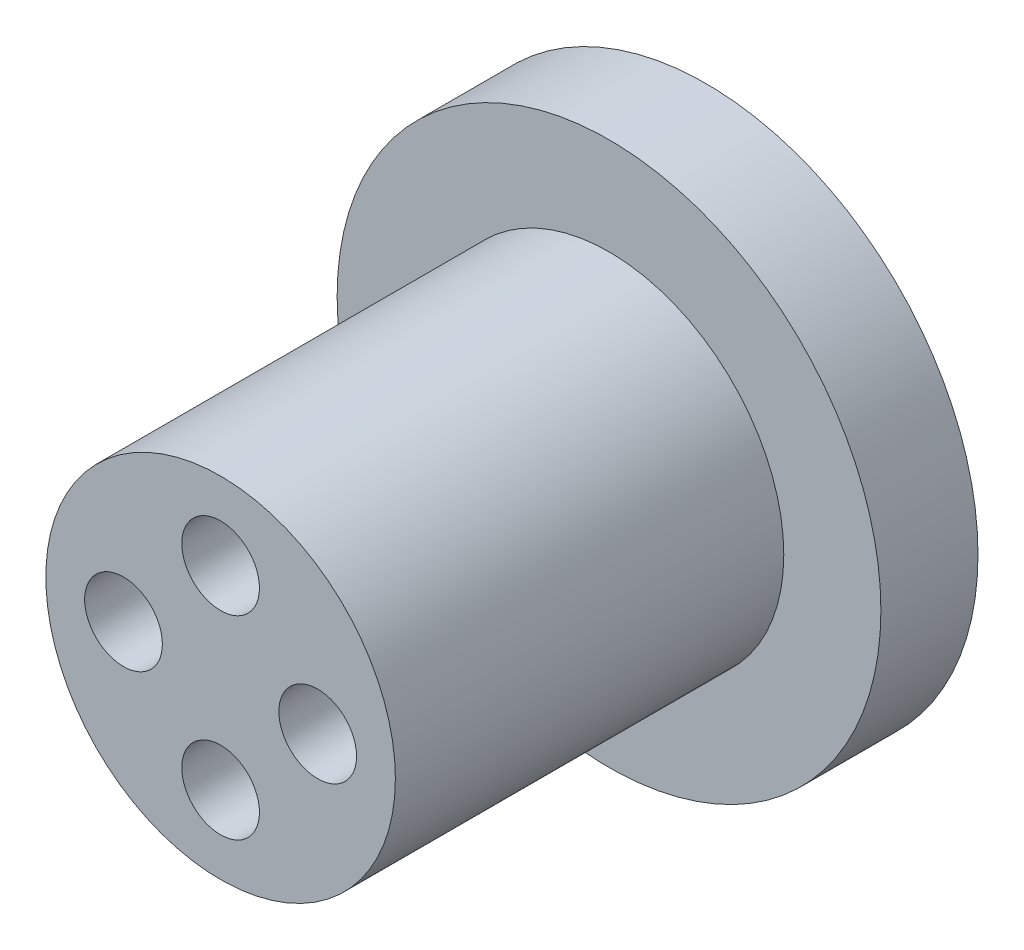
ISO-10303-21;
HEADER;
FILE_DESCRIPTION(('STEP AP214'),'2;1');
FILE_NAME('part.step','',(''),(''),'','','');
FILE_SCHEMA(('AUTOMOTIVE_DESIGN { 1 0 10303 214 1 1 1 1 }'));
ENDSEC;
DATA;
#1=APPLICATION_CONTEXT('core data for automotive mechanical design processes');
#2=APPLICATION_PROTOCOL_DEFINITION('international standard','automotive_design',2000,#1);
#3=PRODUCT_CONTEXT('',#1,'mechanical');
#4=PRODUCT('Part','Part','',(#3));
#5=PRODUCT_RELATED_PRODUCT_CATEGORY('part','',(#4));
#6=PRODUCT_DEFINITION_FORMATION('','',#4);
#7=PRODUCT_DEFINITION_CONTEXT('part definition',#1,'design');
#8=PRODUCT_DEFINITION('design','',#6,#7);
#9=PRODUCT_DEFINITION_SHAPE('','',#8);
#10=(LENGTH_UNIT() NAMED_UNIT(*) SI_UNIT(.MILLI.,.METRE.));
#11=(NAMED_UNIT(*) PLANE_ANGLE_UNIT() SI_UNIT($,.RADIAN.));
#12=(NAMED_UNIT(*) SI_UNIT($,.STERADIAN.) SOLID_ANGLE_UNIT());
#13=UNCERTAINTY_MEASURE_WITH_UNIT(LENGTH_MEASURE(1.E-05),#10,'distance_accuracy_value','');
#14=(GEOMETRIC_REPRESENTATION_CONTEXT(3) GLOBAL_UNCERTAINTY_ASSIGNED_CONTEXT((#13)) GLOBAL_UNIT_ASSIGNED_CONTEXT((#10,
#11,#12)) REPRESENTATION_CONTEXT('',''));
#15=CARTESIAN_POINT('',(0.,0.,0.));
#16=DIRECTION('',(0.,0.,1.));
#17=DIRECTION('',(1.,0.,0.));
#18=AXIS2_PLACEMENT_3D('',#15,#16,#17);
#19=CARTESIAN_POINT('',(0.,0.,2.5));
#20=DIRECTION('',(0.,0.,-1.));
#21=DIRECTION('',(-1.,0.,0.));
#22=AXIS2_PLACEMENT_3D('',#19,#20,#21);
#23=CYLINDRICAL_SURFACE('',#22,7.);
#24=CARTESIAN_POINT('',(0.,0.,2.5));
#25=DIRECTION('',(0.,0.,1.));
#26=DIRECTION('',(1.,0.,0.));
#27=AXIS2_PLACEMENT_3D('',#24,#25,#26);
#28=CIRCLE('',#27,7.);
#29=CARTESIAN_POINT('',(7.,0.,2.5));
#30=VERTEX_POINT('',#29);
#31=EDGE_CURVE('E45',#30,#30,#28,.T.);
#32=ORIENTED_EDGE('',*,*,#31,.F.);
#33=EDGE_LOOP('',(#32));
#34=FACE_BOUND('',#33,.T.);
#35=CARTESIAN_POINT('',(0.,0.,0.));
#36=DIRECTION('',(0.,0.,1.));
#37=DIRECTION('',(1.,0.,0.));
#38=AXIS2_PLACEMENT_3D('',#35,#36,#37);
#39=CIRCLE('',#38,7.);
#40=CARTESIAN_POINT('',(7.,0.,0.));
#41=VERTEX_POINT('',#40);
#42=EDGE_CURVE('E40',#41,#41,#39,.T.);
#43=ORIENTED_EDGE('',*,*,#42,.T.);
#44=EDGE_LOOP('',(#43));
#45=FACE_BOUND('',#44,.T.);
#46=ADVANCED_FACE('F37',(#34,#45),#23,.T.);
#47=CARTESIAN_POINT('',(0.,0.,2.5));
#48=DIRECTION('',(0.,0.,1.));
#49=DIRECTION('',(1.,0.,0.));
#50=AXIS2_PLACEMENT_3D('',#47,#48,#49);
#51=PLANE('',#50);
#52=CARTESIAN_POINT('',(0.,0.,2.5));
#53=DIRECTION('',(0.,0.,1.));
#54=DIRECTION('',(1.,0.,0.));
#55=AXIS2_PLACEMENT_3D('',#52,#53,#54);
#56=CIRCLE('',#55,4.5);
#57=CARTESIAN_POINT('',(4.5,0.,2.5));
#58=VERTEX_POINT('',#57);
#59=EDGE_CURVE('E10',#58,#58,#56,.T.);
#60=ORIENTED_EDGE('',*,*,#59,.F.);
#61=EDGE_LOOP('',(#60));
#62=FACE_BOUND('',#61,.T.);
#63=ORIENTED_EDGE('',*,*,#31,.T.);
#64=EDGE_LOOP('',(#63));
#65=FACE_BOUND('',#64,.T.);
#66=ADVANCED_FACE('F118',(#62,#65),#51,.T.);
#67=CARTESIAN_POINT('',(0.,0.,0.));
#68=DIRECTION('',(0.,0.,1.));
#69=DIRECTION('',(1.,0.,0.));
#70=AXIS2_PLACEMENT_3D('',#67,#68,#69);
#71=PLANE('',#70);
#72=ORIENTED_EDGE('',*,*,#42,.F.);
#73=EDGE_LOOP('',(#72));
#74=FACE_BOUND('',#73,.T.);
#75=ADVANCED_FACE('F113',(#74),#71,.F.);
#76=CARTESIAN_POINT('',(0.,0.,12.5));
#77=DIRECTION('',(0.,0.,-1.));
#78=DIRECTION('',(-1.,0.,0.));
#79=AXIS2_PLACEMENT_3D('',#76,#77,#78);
#80=CYLINDRICAL_SURFACE('',#79,4.5);
#81=CARTESIAN_POINT('',(0.,0.,12.5));
#82=DIRECTION('',(0.,0.,1.));
#83=DIRECTION('',(1.,0.,0.));
#84=AXIS2_PLACEMENT_3D('',#81,#82,#83);
#85=CIRCLE('',#84,4.5);
#86=CARTESIAN_POINT('',(4.5,0.,12.5));
#87=VERTEX_POINT('',#86);
#88=EDGE_CURVE('E52',#87,#87,#85,.T.);
#89=ORIENTED_EDGE('',*,*,#88,.F.);
#90=EDGE_LOOP('',(#89));
#91=FACE_BOUND('',#90,.T.);
#92=ORIENTED_EDGE('',*,*,#59,.T.);
#93=EDGE_LOOP('',(#92));
#94=FACE_BOUND('',#93,.T.);
#95=ADVANCED_FACE('F102',(#91,#94),#80,.T.);
#96=CARTESIAN_POINT('',(0.,0.,12.5));
#97=DIRECTION('',(0.,0.,1.));
#98=DIRECTION('',(1.,0.,0.));
#99=AXIS2_PLACEMENT_3D('',#96,#97,#98);
#100=PLANE('',#99);
#101=CARTESIAN_POINT('',(0.,2.5,12.5));
#102=DIRECTION('',(0.,0.,1.));
#103=DIRECTION('',(1.,0.,0.));
#104=AXIS2_PLACEMENT_3D('',#101,#102,#103);
#105=CIRCLE('',#104,1.);
#106=CARTESIAN_POINT('',(1.,2.5,12.5));
#107=VERTEX_POINT('',#106);
#108=EDGE_CURVE('E81',#107,#107,#105,.T.);
#109=ORIENTED_EDGE('',*,*,#108,.F.);
#110=EDGE_LOOP('',(#109));
#111=FACE_BOUND('',#110,.T.);
#112=CARTESIAN_POINT('',(2.50000000000007,0.,12.5));
#113=DIRECTION('',(0.,0.,1.));
#114=DIRECTION('',(1.,0.,0.));
#115=AXIS2_PLACEMENT_3D('',#112,#113,#114);
#116=CIRCLE('',#115,1.);
#117=CARTESIAN_POINT('',(3.50000000000007,0.,12.5));
#118=VERTEX_POINT('',#117);
#119=EDGE_CURVE('E73',#118,#118,#116,.T.);
#120=ORIENTED_EDGE('',*,*,#119,.F.);
#121=EDGE_LOOP('',(#120));
#122=FACE_BOUND('',#121,.T.);
#123=CARTESIAN_POINT('',(1.4119006205266E-13,-2.5,12.5));
#124=DIRECTION('',(0.,0.,1.));
#125=DIRECTION('',(1.,0.,0.));
#126=AXIS2_PLACEMENT_3D('',#123,#124,#125);
#127=CIRCLE('',#126,1.);
#128=CARTESIAN_POINT('',(1.00000000000014,-2.5,12.5));
#129=VERTEX_POINT('',#128);
#130=EDGE_CURVE('E65',#129,#129,#127,.T.);
#131=ORIENTED_EDGE('',*,*,#130,.F.);
#132=EDGE_LOOP('',(#131));
#133=FACE_BOUND('',#132,.T.);
#134=CARTESIAN_POINT('',(-2.49999999999993,0.,12.5));
#135=DIRECTION('',(0.,0.,1.));
#136=DIRECTION('',(1.,0.,0.));
#137=AXIS2_PLACEMENT_3D('',#134,#135,#136);
#138=CIRCLE('',#137,1.);
#139=CARTESIAN_POINT('',(-1.49999999999993,0.,12.5));
#140=VERTEX_POINT('',#139);
#141=EDGE_CURVE('E57',#140,#140,#138,.T.);
#142=ORIENTED_EDGE('',*,*,#141,.F.);
#143=EDGE_LOOP('',(#142));
#144=FACE_BOUND('',#143,.T.);
#145=ORIENTED_EDGE('',*,*,#88,.T.);
#146=EDGE_LOOP('',(#145));
#147=FACE_BOUND('',#146,.T.);
#148=ADVANCED_FACE('F98',(#111,#122,#133,#144,#147),#100,.T.);
#149=CARTESIAN_POINT('',(-2.49999999999993,0.,7.5));
#150=DIRECTION('',(0.,0.,1.));
#151=DIRECTION('',(1.,0.,0.));
#152=AXIS2_PLACEMENT_3D('',#149,#150,#151);
#153=CYLINDRICAL_SURFACE('',#152,1.);
#154=CARTESIAN_POINT('',(-2.49999999999993,0.,7.5));
#155=DIRECTION('',(0.,0.,1.));
#156=DIRECTION('',(1.,0.,0.));
#157=AXIS2_PLACEMENT_3D('',#154,#155,#156);
#158=CIRCLE('',#157,1.);
#159=CARTESIAN_POINT('',(-1.49999999999993,0.,7.5));
#160=VERTEX_POINT('',#159);
#161=EDGE_CURVE('E61',#160,#160,#158,.T.);
#162=ORIENTED_EDGE('',*,*,#161,.F.);
#163=EDGE_LOOP('',(#162));
#164=FACE_BOUND('',#163,.T.);
#165=ORIENTED_EDGE('',*,*,#141,.T.);
#166=EDGE_LOOP('',(#165));
#167=FACE_BOUND('',#166,.T.);
#168=ADVANCED_FACE('F101',(#164,#167),#153,.F.);
#169=CARTESIAN_POINT('',(-2.49999999999993,0.,7.5));
#170=DIRECTION('',(0.,0.,1.));
#171=DIRECTION('',(1.,0.,0.));
#172=AXIS2_PLACEMENT_3D('',#169,#170,#171);
#173=PLANE('',#172);
#174=ORIENTED_EDGE('',*,*,#161,.T.);
#175=EDGE_LOOP('',(#174));
#176=FACE_BOUND('',#175,.T.);
#177=ADVANCED_FACE('F164',(#176),#173,.T.);
#178=CARTESIAN_POINT('',(1.4119006205266E-13,-2.5,7.5));
#179=DIRECTION('',(0.,0.,1.));
#180=DIRECTION('',(1.,0.,0.));
#181=AXIS2_PLACEMENT_3D('',#178,#179,#180);
#182=CYLINDRICAL_SURFACE('',#181,1.);
#183=CARTESIAN_POINT('',(1.4119006205266E-13,-2.5,7.5));
#184=DIRECTION('',(0.,0.,1.));
#185=DIRECTION('',(1.,0.,0.));
#186=AXIS2_PLACEMENT_3D('',#183,#184,#185);
#187=CIRCLE('',#186,1.);
#188=CARTESIAN_POINT('',(1.00000000000014,-2.5,7.5));
#189=VERTEX_POINT('',#188);
#190=EDGE_CURVE('E69',#189,#189,#187,.T.);
#191=ORIENTED_EDGE('',*,*,#190,.F.);
#192=EDGE_LOOP('',(#191));
#193=FACE_BOUND('',#192,.T.);
#194=ORIENTED_EDGE('',*,*,#130,.T.);
#195=EDGE_LOOP('',(#194));
#196=FACE_BOUND('',#195,.T.);
#197=ADVANCED_FACE('F173',(#193,#196),#182,.F.);
#198=CARTESIAN_POINT('',(1.4119006205266E-13,-2.5,7.5));
#199=DIRECTION('',(0.,0.,1.));
#200=DIRECTION('',(1.,0.,0.));
#201=AXIS2_PLACEMENT_3D('',#198,#199,#200);
#202=PLANE('',#201);
#203=ORIENTED_EDGE('',*,*,#190,.T.);
#204=EDGE_LOOP('',(#203));
#205=FACE_BOUND('',#204,.T.);
#206=ADVANCED_FACE('F182',(#205),#202,.T.);
#207=CARTESIAN_POINT('',(2.50000000000007,0.,7.5));
#208=DIRECTION('',(0.,0.,1.));
#209=DIRECTION('',(1.,0.,0.));
#210=AXIS2_PLACEMENT_3D('',#207,#208,#209);
#211=CYLINDRICAL_SURFACE('',#210,1.);
#212=CARTESIAN_POINT('',(2.50000000000007,0.,7.5));
#213=DIRECTION('',(0.,0.,1.));
#214=DIRECTION('',(1.,0.,0.));
#215=AXIS2_PLACEMENT_3D('',#212,#213,#214);
#216=CIRCLE('',#215,1.);
#217=CARTESIAN_POINT('',(3.50000000000007,0.,7.5));
#218=VERTEX_POINT('',#217);
#219=EDGE_CURVE('E77',#218,#218,#216,.T.);
#220=ORIENTED_EDGE('',*,*,#219,.F.);
#221=EDGE_LOOP('',(#220));
#222=FACE_BOUND('',#221,.T.);
#223=ORIENTED_EDGE('',*,*,#119,.T.);
#224=EDGE_LOOP('',(#223));
#225=FACE_BOUND('',#224,.T.);
#226=ADVANCED_FACE('F191',(#222,#225),#211,.F.);
#227=CARTESIAN_POINT('',(2.50000000000007,0.,7.5));
#228=DIRECTION('',(0.,0.,1.));
#229=DIRECTION('',(1.,0.,0.));
#230=AXIS2_PLACEMENT_3D('',#227,#228,#229);
#231=PLANE('',#230);
#232=ORIENTED_EDGE('',*,*,#219,.T.);
#233=EDGE_LOOP('',(#232));
#234=FACE_BOUND('',#233,.T.);
#235=ADVANCED_FACE('F94',(#234),#231,.T.);
#236=CARTESIAN_POINT('',(0.,2.5,7.5));
#237=DIRECTION('',(0.,0.,1.));
#238=DIRECTION('',(1.,0.,0.));
#239=AXIS2_PLACEMENT_3D('',#236,#237,#238);
#240=CYLINDRICAL_SURFACE('',#239,1.);
#241=CARTESIAN_POINT('',(0.,2.5,7.5));
#242=DIRECTION('',(0.,0.,1.));
#243=DIRECTION('',(1.,0.,0.));
#244=AXIS2_PLACEMENT_3D('',#241,#242,#243);
#245=CIRCLE('',#244,1.);
#246=CARTESIAN_POINT('',(1.,2.5,7.5));
#247=VERTEX_POINT('',#246);
#248=EDGE_CURVE('E56',#247,#247,#245,.T.);
#249=ORIENTED_EDGE('',*,*,#248,.F.);
#250=EDGE_LOOP('',(#249));
#251=FACE_BOUND('',#250,.T.);
#252=ORIENTED_EDGE('',*,*,#108,.T.);
#253=EDGE_LOOP('',(#252));
#254=FACE_BOUND('',#253,.T.);
#255=ADVANCED_FACE('F91',(#251,#254),#240,.F.);
#256=CARTESIAN_POINT('',(0.,2.5,7.5));
#257=DIRECTION('',(0.,0.,1.));
#258=DIRECTION('',(1.,0.,0.));
#259=AXIS2_PLACEMENT_3D('',#256,#257,#258);
#260=PLANE('',#259);
#261=ORIENTED_EDGE('',*,*,#248,.T.);
#262=EDGE_LOOP('',(#261));
#263=FACE_BOUND('',#262,.T.);
#264=ADVANCED_FACE('F89',(#263),#260,.T.);
#265=CLOSED_SHELL('',(#46,#66,#75,#95,#148,#168,#177,#197,#206,#226,#235,#255,#264));
#266=MANIFOLD_SOLID_BREP('B2',#265);
#267=ADVANCED_BREP_SHAPE_REPRESENTATION('',(#18,#266),#14);
#268=SHAPE_DEFINITION_REPRESENTATION(#9,#267);
ENDSEC;
END-ISO-10303-21;
